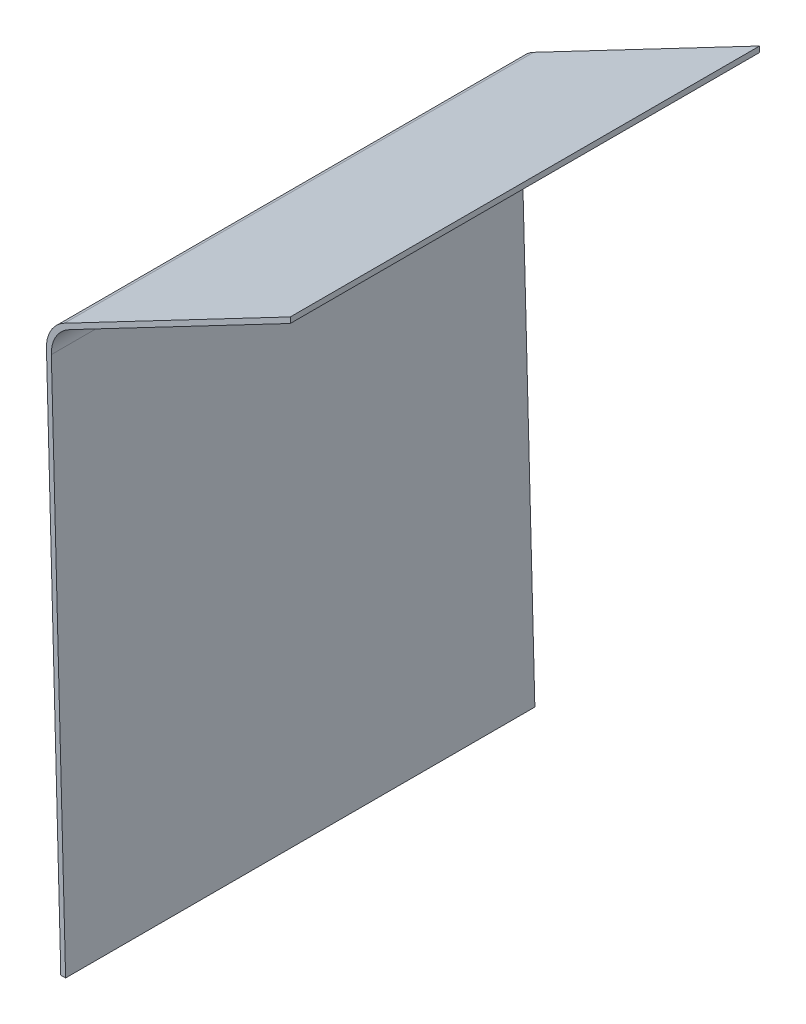
ISO-10303-21;
HEADER;
FILE_DESCRIPTION(('STEP AP214'),'2;1');
FILE_NAME('part.step','',(''),(''),'','','');
FILE_SCHEMA(('AUTOMOTIVE_DESIGN { 1 0 10303 214 1 1 1 1 }'));
ENDSEC;
DATA;
#1=APPLICATION_CONTEXT('core data for automotive mechanical design processes');
#2=APPLICATION_PROTOCOL_DEFINITION('international standard','automotive_design',2000,#1);
#3=PRODUCT_CONTEXT('',#1,'mechanical');
#4=PRODUCT('Part','Part','',(#3));
#5=PRODUCT_RELATED_PRODUCT_CATEGORY('part','',(#4));
#6=PRODUCT_DEFINITION_FORMATION('','',#4);
#7=PRODUCT_DEFINITION_CONTEXT('part definition',#1,'design');
#8=PRODUCT_DEFINITION('design','',#6,#7);
#9=PRODUCT_DEFINITION_SHAPE('','',#8);
#10=(LENGTH_UNIT() NAMED_UNIT(*) SI_UNIT(.MILLI.,.METRE.));
#11=(NAMED_UNIT(*) PLANE_ANGLE_UNIT() SI_UNIT($,.RADIAN.));
#12=(NAMED_UNIT(*) SI_UNIT($,.STERADIAN.) SOLID_ANGLE_UNIT());
#13=UNCERTAINTY_MEASURE_WITH_UNIT(LENGTH_MEASURE(1.E-05),#10,'distance_accuracy_value','');
#14=(GEOMETRIC_REPRESENTATION_CONTEXT(3) GLOBAL_UNCERTAINTY_ASSIGNED_CONTEXT((#13)) GLOBAL_UNIT_ASSIGNED_CONTEXT((#10,
#11,#12)) REPRESENTATION_CONTEXT('',''));
#15=CARTESIAN_POINT('',(0.,0.,0.));
#16=DIRECTION('',(0.,0.,1.));
#17=DIRECTION('',(1.,0.,0.));
#18=AXIS2_PLACEMENT_3D('',#15,#16,#17);
#19=CARTESIAN_POINT('',(-129.581043787516,-88.7275839319161,-280.));
#20=DIRECTION('',(0.,0.,1.));
#21=DIRECTION('',(1.,0.,0.));
#22=AXIS2_PLACEMENT_3D('',#19,#20,#21);
#23=CYLINDRICAL_SURFACE('',#22,20.);
#24=CARTESIAN_POINT('',(-129.581043787516,-88.7275839319161,0.));
#25=DIRECTION('',(0.,0.,1.));
#26=DIRECTION('',(1.,0.,0.));
#27=AXIS2_PLACEMENT_3D('',#24,#25,#26);
#28=CIRCLE('',#27,20.);
#29=CARTESIAN_POINT('',(-138.866012838378,-71.0134836238413,0.));
#30=VERTEX_POINT('',#29);
#31=CARTESIAN_POINT('',(-149.573857665783,-89.2636746229351,0.));
#32=VERTEX_POINT('',#31);
#33=EDGE_CURVE('E136',#30,#32,#28,.T.);
#34=ORIENTED_EDGE('',*,*,#33,.T.);
#35=DIRECTION('',(0.,0.,1.));
#36=VECTOR('',#35,1.);
#37=CARTESIAN_POINT('',(-149.573857665783,-89.2636746229351,-280.));
#38=LINE('',#37,#36);
#39=CARTESIAN_POINT('',(-149.573857665783,-89.2636746229351,-280.));
#40=VERTEX_POINT('',#39);
#41=EDGE_CURVE('E11',#40,#32,#38,.T.);
#42=ORIENTED_EDGE('',*,*,#41,.F.);
#43=CARTESIAN_POINT('',(-129.581043787516,-88.7275839319161,-280.));
#44=DIRECTION('',(0.,0.,1.));
#45=DIRECTION('',(1.,0.,0.));
#46=AXIS2_PLACEMENT_3D('',#43,#44,#45);
#47=CIRCLE('',#46,20.);
#48=CARTESIAN_POINT('',(-138.866012838378,-71.0134836238413,-280.));
#49=VERTEX_POINT('',#48);
#50=EDGE_CURVE('E52',#49,#40,#47,.T.);
#51=ORIENTED_EDGE('',*,*,#50,.F.);
#52=DIRECTION('',(0.,0.,1.));
#53=VECTOR('',#52,1.);
#54=CARTESIAN_POINT('',(-138.866012838378,-71.0134836238413,-280.));
#55=LINE('',#54,#53);
#56=EDGE_CURVE('E37',#49,#30,#55,.T.);
#57=ORIENTED_EDGE('',*,*,#56,.T.);
#58=EDGE_LOOP('',(#34,#42,#51,#57));
#59=FACE_BOUND('',#58,.T.);
#60=ADVANCED_FACE('F34',(#59),#23,.F.);
#61=CARTESIAN_POINT('',(-151.858202930193,-4.07195152425374,-280.));
#62=DIRECTION('',(0.999640693913322,0.0268045345509426,0.));
#63=DIRECTION('',(-0.0268045345509426,0.999640693913322,0.));
#64=AXIS2_PLACEMENT_3D('',#61,#62,#63);
#65=PLANE('',#64);
#66=DIRECTION('',(-0.0268045345509426,0.999640693913322,0.));
#67=VECTOR('',#66,1.);
#68=CARTESIAN_POINT('',(-151.858202930193,-4.07195152425374,0.));
#69=LINE('',#68,#67);
#70=CARTESIAN_POINT('',(-141.05,-407.149999999993,0.));
#71=VERTEX_POINT('',#70);
#72=EDGE_CURVE('E155',#71,#32,#69,.T.);
#73=ORIENTED_EDGE('',*,*,#72,.F.);
#74=DIRECTION('',(0.,0.,1.));
#75=VECTOR('',#74,1.);
#76=CARTESIAN_POINT('',(-141.05,-407.149999999993,-280.));
#77=LINE('',#76,#75);
#78=CARTESIAN_POINT('',(-141.05,-407.149999999993,-280.));
#79=VERTEX_POINT('',#78);
#80=EDGE_CURVE('E43',#79,#71,#77,.T.);
#81=ORIENTED_EDGE('',*,*,#80,.F.);
#82=DIRECTION('',(-0.0268045345509426,0.999640693913322,0.));
#83=VECTOR('',#82,1.);
#84=CARTESIAN_POINT('',(-151.858202930193,-4.07195152425374,-280.));
#85=LINE('',#84,#83);
#86=EDGE_CURVE('E125',#79,#40,#85,.T.);
#87=ORIENTED_EDGE('',*,*,#86,.T.);
#88=ORIENTED_EDGE('',*,*,#41,.T.);
#89=EDGE_LOOP('',(#73,#81,#87,#88));
#90=FACE_BOUND('',#89,.T.);
#91=ADVANCED_FACE('F185',(#90),#65,.T.);
#92=CARTESIAN_POINT('',(0.,-407.149999999993,-280.));
#93=DIRECTION('',(0.,-1.,0.));
#94=DIRECTION('',(0.,0.,-1.));
#95=AXIS2_PLACEMENT_3D('',#92,#93,#94);
#96=PLANE('',#95);
#97=DIRECTION('',(1.,0.,0.));
#98=VECTOR('',#97,1.);
#99=CARTESIAN_POINT('',(0.,-407.149999999993,0.));
#100=LINE('',#99,#98);
#101=CARTESIAN_POINT('',(-144.05,-407.149999999993,0.));
#102=VERTEX_POINT('',#101);
#103=EDGE_CURVE('E115',#102,#71,#100,.T.);
#104=ORIENTED_EDGE('',*,*,#103,.F.);
#105=DIRECTION('',(0.,0.,1.));
#106=VECTOR('',#105,1.);
#107=CARTESIAN_POINT('',(-144.05,-407.149999999993,-280.));
#108=LINE('',#107,#106);
#109=CARTESIAN_POINT('',(-144.05,-407.149999999993,-280.));
#110=VERTEX_POINT('',#109);
#111=EDGE_CURVE('E111',#110,#102,#108,.T.);
#112=ORIENTED_EDGE('',*,*,#111,.F.);
#113=DIRECTION('',(1.,0.,0.));
#114=VECTOR('',#113,1.);
#115=CARTESIAN_POINT('',(0.,-407.149999999993,-280.));
#116=LINE('',#115,#114);
#117=EDGE_CURVE('E114',#110,#79,#116,.T.);
#118=ORIENTED_EDGE('',*,*,#117,.T.);
#119=ORIENTED_EDGE('',*,*,#80,.T.);
#120=EDGE_LOOP('',(#104,#112,#118,#119));
#121=FACE_BOUND('',#120,.T.);
#122=ADVANCED_FACE('F113',(#121),#96,.T.);
#123=CARTESIAN_POINT('',(-144.05,0.,-280.));
#124=DIRECTION('',(-1.,0.,0.));
#125=DIRECTION('',(0.,0.,1.));
#126=AXIS2_PLACEMENT_3D('',#123,#124,#125);
#127=PLANE('',#126);
#128=DIRECTION('',(0.,-1.,0.));
#129=VECTOR('',#128,1.);
#130=CARTESIAN_POINT('',(-144.05,0.,0.));
#131=LINE('',#130,#129);
#132=CARTESIAN_POINT('',(-144.05,-401.82347706188,0.));
#133=VERTEX_POINT('',#132);
#134=EDGE_CURVE('E152',#133,#102,#131,.T.);
#135=ORIENTED_EDGE('',*,*,#134,.F.);
#136=DIRECTION('',(0.,0.,1.));
#137=VECTOR('',#136,1.);
#138=CARTESIAN_POINT('',(-144.05,-401.82347706188,-280.));
#139=LINE('',#138,#137);
#140=CARTESIAN_POINT('',(-144.05,-401.82347706188,-280.));
#141=VERTEX_POINT('',#140);
#142=EDGE_CURVE('E120',#141,#133,#139,.T.);
#143=ORIENTED_EDGE('',*,*,#142,.F.);
#144=DIRECTION('',(0.,-1.,0.));
#145=VECTOR('',#144,1.);
#146=CARTESIAN_POINT('',(-144.05,0.,-280.));
#147=LINE('',#146,#145);
#148=EDGE_CURVE('E124',#141,#110,#147,.T.);
#149=ORIENTED_EDGE('',*,*,#148,.T.);
#150=ORIENTED_EDGE('',*,*,#111,.T.);
#151=EDGE_LOOP('',(#135,#143,#149,#150));
#152=FACE_BOUND('',#151,.T.);
#153=ADVANCED_FACE('F127',(#152),#127,.T.);
#154=CARTESIAN_POINT('',(-154.71332381276,-4.14850921824302,-280.));
#155=DIRECTION('',(0.999640693913322,0.0268045345509424,0.));
#156=DIRECTION('',(-0.0268045345509424,0.999640693913322,0.));
#157=AXIS2_PLACEMENT_3D('',#154,#155,#156);
#158=PLANE('',#157);
#159=DIRECTION('',(-0.0268045345509424,0.999640693913322,0.));
#160=VECTOR('',#159,1.);
#161=CARTESIAN_POINT('',(-154.71332381276,-4.14850921824302,0.));
#162=LINE('',#161,#160);
#163=CARTESIAN_POINT('',(-152.480995181742,-87.4003387738841,0.));
#164=VERTEX_POINT('',#163);
#165=EDGE_CURVE('E149',#133,#164,#162,.T.);
#166=ORIENTED_EDGE('',*,*,#165,.T.);
#167=DIRECTION('',(0.,0.,1.));
#168=VECTOR('',#167,1.);
#169=CARTESIAN_POINT('',(-152.480995181742,-87.4003387738841,-280.));
#170=LINE('',#169,#168);
#171=CARTESIAN_POINT('',(-152.480995181742,-87.4003387738841,-280.));
#172=VERTEX_POINT('',#171);
#173=EDGE_CURVE('E160',#172,#164,#170,.T.);
#174=ORIENTED_EDGE('',*,*,#173,.F.);
#175=DIRECTION('',(-0.0268045345509424,0.999640693913322,0.));
#176=VECTOR('',#175,1.);
#177=CARTESIAN_POINT('',(-154.71332381276,-4.14850921824302,-280.));
#178=LINE('',#177,#176);
#179=EDGE_CURVE('E129',#141,#172,#178,.T.);
#180=ORIENTED_EDGE('',*,*,#179,.F.);
#181=ORIENTED_EDGE('',*,*,#142,.T.);
#182=EDGE_LOOP('',(#166,#174,#180,#181));
#183=FACE_BOUND('',#182,.T.);
#184=ADVANCED_FACE('F198',(#183),#158,.F.);
#185=CARTESIAN_POINT('',(-132.488181303475,-86.8642480828651,-280.));
#186=DIRECTION('',(0.,0.,1.));
#187=DIRECTION('',(1.,0.,0.));
#188=AXIS2_PLACEMENT_3D('',#185,#186,#187);
#189=CYLINDRICAL_SURFACE('',#188,20.);
#190=CARTESIAN_POINT('',(-132.488181303475,-86.8642480828651,0.));
#191=DIRECTION('',(0.,0.,1.));
#192=DIRECTION('',(1.,0.,0.));
#193=AXIS2_PLACEMENT_3D('',#190,#191,#192);
#194=CIRCLE('',#193,20.);
#195=CARTESIAN_POINT('',(-141.773150354337,-69.1501477747903,0.));
#196=VERTEX_POINT('',#195);
#197=EDGE_CURVE('E146',#196,#164,#194,.T.);
#198=ORIENTED_EDGE('',*,*,#197,.F.);
#199=DIRECTION('',(0.,0.,1.));
#200=VECTOR('',#199,1.);
#201=CARTESIAN_POINT('',(-141.773150354337,-69.1501477747903,-280.));
#202=LINE('',#201,#200);
#203=CARTESIAN_POINT('',(-141.773150354337,-69.1501477747903,-280.));
#204=VERTEX_POINT('',#203);
#205=EDGE_CURVE('E162',#204,#196,#202,.T.);
#206=ORIENTED_EDGE('',*,*,#205,.F.);
#207=CARTESIAN_POINT('',(-132.488181303475,-86.8642480828651,-280.));
#208=DIRECTION('',(0.,0.,1.));
#209=DIRECTION('',(1.,0.,0.));
#210=AXIS2_PLACEMENT_3D('',#207,#208,#209);
#211=CIRCLE('',#210,20.);
#212=EDGE_CURVE('E131',#204,#172,#211,.T.);
#213=ORIENTED_EDGE('',*,*,#212,.T.);
#214=ORIENTED_EDGE('',*,*,#173,.T.);
#215=EDGE_LOOP('',(#198,#206,#213,#214));
#216=FACE_BOUND('',#215,.T.);
#217=ADVANCED_FACE('F201',(#216),#189,.T.);
#218=CARTESIAN_POINT('',(-2.12223425465155,4.04885253340077,-280.));
#219=DIRECTION('',(0.464248452543096,-0.885705015403741,0.));
#220=DIRECTION('',(0.885705015403741,0.464248452543096,0.));
#221=AXIS2_PLACEMENT_3D('',#218,#219,#220);
#222=PLANE('',#221);
#223=DIRECTION('',(0.885705015403741,0.464248452543096,0.));
#224=VECTOR('',#223,1.);
#225=CARTESIAN_POINT('',(-2.12223425465155,4.04885253340077,0.));
#226=LINE('',#225,#224);
#227=CARTESIAN_POINT('',(-6.985,1.5,0.));
#228=VERTEX_POINT('',#227);
#229=EDGE_CURVE('E144',#196,#228,#226,.T.);
#230=ORIENTED_EDGE('',*,*,#229,.T.);
#231=DIRECTION('',(0.,0.,1.));
#232=VECTOR('',#231,1.);
#233=CARTESIAN_POINT('',(-6.985,1.5,-280.));
#234=LINE('',#233,#232);
#235=CARTESIAN_POINT('',(-6.985,1.5,-280.));
#236=VERTEX_POINT('',#235);
#237=EDGE_CURVE('E164',#236,#228,#234,.T.);
#238=ORIENTED_EDGE('',*,*,#237,.F.);
#239=DIRECTION('',(0.885705015403741,0.464248452543096,0.));
#240=VECTOR('',#239,1.);
#241=CARTESIAN_POINT('',(-2.12223425465155,4.04885253340077,-280.));
#242=LINE('',#241,#240);
#243=EDGE_CURVE('E216',#204,#236,#242,.T.);
#244=ORIENTED_EDGE('',*,*,#243,.F.);
#245=ORIENTED_EDGE('',*,*,#205,.T.);
#246=EDGE_LOOP('',(#230,#238,#244,#245));
#247=FACE_BOUND('',#246,.T.);
#248=ADVANCED_FACE('F181',(#247),#222,.F.);
#249=CARTESIAN_POINT('',(-6.98500000000013,-5.94690420800669E-13,-280.));
#250=DIRECTION('',(-1.,0.,0.));
#251=DIRECTION('',(0.,-1.,0.));
#252=AXIS2_PLACEMENT_3D('',#249,#250,#251);
#253=PLANE('',#252);
#254=DIRECTION('',(0.,-1.,0.));
#255=VECTOR('',#254,1.);
#256=CARTESIAN_POINT('',(-6.98500000000013,-5.94690420800669E-13,0.));
#257=LINE('',#256,#255);
#258=CARTESIAN_POINT('',(-6.98499999999997,-1.88713222554402,0.));
#259=VERTEX_POINT('',#258);
#260=EDGE_CURVE('E141',#228,#259,#257,.T.);
#261=ORIENTED_EDGE('',*,*,#260,.T.);
#262=DIRECTION('',(0.,0.,1.));
#263=VECTOR('',#262,1.);
#264=CARTESIAN_POINT('',(-6.98499999999997,-1.88713222554402,-280.));
#265=LINE('',#264,#263);
#266=CARTESIAN_POINT('',(-6.98499999999997,-1.88713222554402,-280.));
#267=VERTEX_POINT('',#266);
#268=EDGE_CURVE('E166',#267,#259,#265,.T.);
#269=ORIENTED_EDGE('',*,*,#268,.F.);
#270=DIRECTION('',(0.,-1.,0.));
#271=VECTOR('',#270,1.);
#272=CARTESIAN_POINT('',(-6.98500000000013,-5.94690420800669E-13,-280.));
#273=LINE('',#272,#271);
#274=EDGE_CURVE('E215',#236,#267,#273,.T.);
#275=ORIENTED_EDGE('',*,*,#274,.F.);
#276=ORIENTED_EDGE('',*,*,#237,.T.);
#277=EDGE_LOOP('',(#261,#269,#275,#276));
#278=FACE_BOUND('',#277,.T.);
#279=ADVANCED_FACE('F175',(#278),#253,.F.);
#280=CARTESIAN_POINT('',(-0.729488897022274,1.39173748718956,-280.));
#281=DIRECTION('',(0.464248452543096,-0.885705015403741,0.));
#282=DIRECTION('',(0.885705015403741,0.464248452543096,0.));
#283=AXIS2_PLACEMENT_3D('',#280,#281,#282);
#284=PLANE('',#283);
#285=DIRECTION('',(0.885705015403741,0.464248452543096,0.));
#286=VECTOR('',#285,1.);
#287=CARTESIAN_POINT('',(-0.729488897022274,1.39173748718956,0.));
#288=LINE('',#287,#286);
#289=EDGE_CURVE('E138',#30,#259,#288,.T.);
#290=ORIENTED_EDGE('',*,*,#289,.F.);
#291=ORIENTED_EDGE('',*,*,#56,.F.);
#292=DIRECTION('',(0.885705015403741,0.464248452543096,0.));
#293=VECTOR('',#292,1.);
#294=CARTESIAN_POINT('',(-0.729488897022274,1.39173748718956,-280.));
#295=LINE('',#294,#293);
#296=EDGE_CURVE('E217',#49,#267,#295,.T.);
#297=ORIENTED_EDGE('',*,*,#296,.T.);
#298=ORIENTED_EDGE('',*,*,#268,.T.);
#299=EDGE_LOOP('',(#290,#291,#297,#298));
#300=FACE_BOUND('',#299,.T.);
#301=ADVANCED_FACE('F173',(#300),#284,.T.);
#302=CARTESIAN_POINT('',(0.,0.,-280.));
#303=DIRECTION('',(0.,0.,1.));
#304=DIRECTION('',(1.,0.,0.));
#305=AXIS2_PLACEMENT_3D('',#302,#303,#304);
#306=PLANE('',#305);
#307=ORIENTED_EDGE('',*,*,#50,.T.);
#308=ORIENTED_EDGE('',*,*,#86,.F.);
#309=ORIENTED_EDGE('',*,*,#117,.F.);
#310=ORIENTED_EDGE('',*,*,#148,.F.);
#311=ORIENTED_EDGE('',*,*,#179,.T.);
#312=ORIENTED_EDGE('',*,*,#212,.F.);
#313=ORIENTED_EDGE('',*,*,#243,.T.);
#314=ORIENTED_EDGE('',*,*,#274,.T.);
#315=ORIENTED_EDGE('',*,*,#296,.F.);
#316=EDGE_LOOP('',(#307,#308,#309,#310,#311,#312,#313,#314,#315));
#317=FACE_BOUND('',#316,.T.);
#318=ADVANCED_FACE('F123',(#317),#306,.F.);
#319=CARTESIAN_POINT('',(0.,0.,0.));
#320=DIRECTION('',(0.,0.,1.));
#321=DIRECTION('',(1.,0.,0.));
#322=AXIS2_PLACEMENT_3D('',#319,#320,#321);
#323=PLANE('',#322);
#324=ORIENTED_EDGE('',*,*,#33,.F.);
#325=ORIENTED_EDGE('',*,*,#289,.T.);
#326=ORIENTED_EDGE('',*,*,#260,.F.);
#327=ORIENTED_EDGE('',*,*,#229,.F.);
#328=ORIENTED_EDGE('',*,*,#197,.T.);
#329=ORIENTED_EDGE('',*,*,#165,.F.);
#330=ORIENTED_EDGE('',*,*,#134,.T.);
#331=ORIENTED_EDGE('',*,*,#103,.T.);
#332=ORIENTED_EDGE('',*,*,#72,.T.);
#333=EDGE_LOOP('',(#324,#325,#326,#327,#328,#329,#330,#331,#332));
#334=FACE_BOUND('',#333,.T.);
#335=ADVANCED_FACE('F171',(#334),#323,.T.);
#336=CLOSED_SHELL('',(#60,#91,#122,#153,#184,#217,#248,#279,#301,#318,#335));
#337=MANIFOLD_SOLID_BREP('B2',#336);
#338=ADVANCED_BREP_SHAPE_REPRESENTATION('',(#18,#337),#14);
#339=SHAPE_DEFINITION_REPRESENTATION(#9,#338);
ENDSEC;
END-ISO-10303-21;
